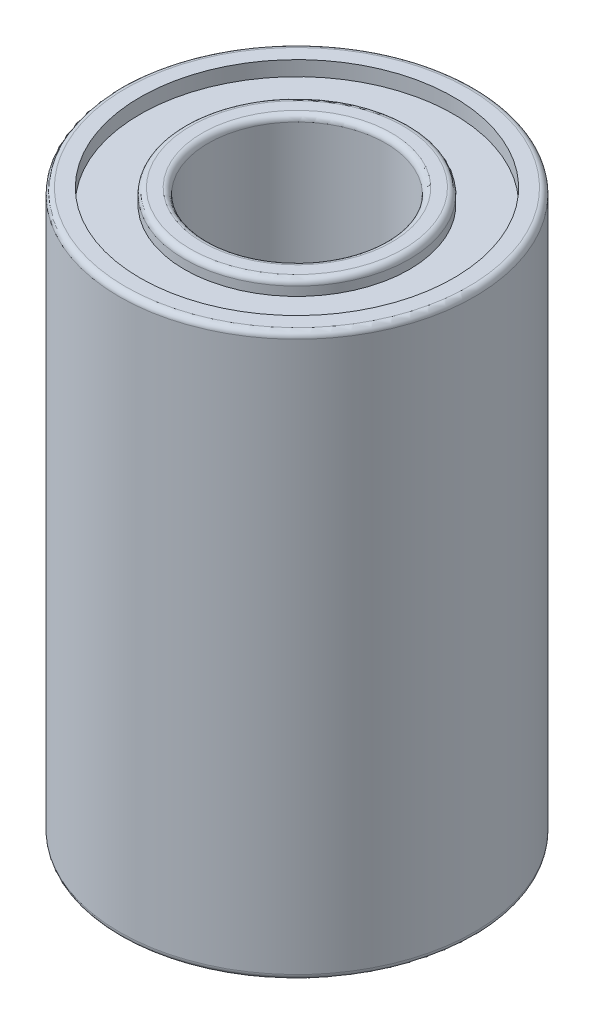
ISO-10303-21;
HEADER;
FILE_DESCRIPTION(('STEP AP214'),'2;1');
FILE_NAME('part.step','',(''),(''),'','','');
FILE_SCHEMA(('AUTOMOTIVE_DESIGN { 1 0 10303 214 1 1 1 1 }'));
ENDSEC;
DATA;
#1=APPLICATION_CONTEXT('core data for automotive mechanical design processes');
#2=APPLICATION_PROTOCOL_DEFINITION('international standard','automotive_design',2000,#1);
#3=PRODUCT_CONTEXT('',#1,'mechanical');
#4=PRODUCT('Part','Part','',(#3));
#5=PRODUCT_RELATED_PRODUCT_CATEGORY('part','',(#4));
#6=PRODUCT_DEFINITION_FORMATION('','',#4);
#7=PRODUCT_DEFINITION_CONTEXT('part definition',#1,'design');
#8=PRODUCT_DEFINITION('design','',#6,#7);
#9=PRODUCT_DEFINITION_SHAPE('','',#8);
#10=(LENGTH_UNIT() NAMED_UNIT(*) SI_UNIT(.MILLI.,.METRE.));
#11=(NAMED_UNIT(*) PLANE_ANGLE_UNIT() SI_UNIT($,.RADIAN.));
#12=(NAMED_UNIT(*) SI_UNIT($,.STERADIAN.) SOLID_ANGLE_UNIT());
#13=UNCERTAINTY_MEASURE_WITH_UNIT(LENGTH_MEASURE(1.E-05),#10,'distance_accuracy_value','');
#14=(GEOMETRIC_REPRESENTATION_CONTEXT(3) GLOBAL_UNCERTAINTY_ASSIGNED_CONTEXT((#13)) GLOBAL_UNIT_ASSIGNED_CONTEXT((#10,
#11,#12)) REPRESENTATION_CONTEXT('',''));
#15=CARTESIAN_POINT('',(0.,0.,0.));
#16=DIRECTION('',(0.,0.,1.));
#17=DIRECTION('',(1.,0.,0.));
#18=AXIS2_PLACEMENT_3D('',#15,#16,#17);
#19=CARTESIAN_POINT('',(0.,0.,0.));
#20=DIRECTION('',(0.,1.,0.));
#21=DIRECTION('',(0.,0.,1.));
#22=AXIS2_PLACEMENT_3D('',#19,#20,#21);
#23=PLANE('',#22);
#24=CARTESIAN_POINT('',(0.,0.,0.));
#25=DIRECTION('',(0.,1.,0.));
#26=DIRECTION('',(0.,0.,1.));
#27=AXIS2_PLACEMENT_3D('',#24,#25,#26);
#28=CIRCLE('',#27,3.2);
#29=CARTESIAN_POINT('',(0.,0.,3.2));
#30=VERTEX_POINT('',#29);
#31=EDGE_CURVE('E76',#30,#30,#28,.T.);
#32=ORIENTED_EDGE('',*,*,#31,.T.);
#33=EDGE_LOOP('',(#32));
#34=FACE_BOUND('',#33,.T.);
#35=CARTESIAN_POINT('',(0.,0.,0.));
#36=DIRECTION('',(0.,1.,0.));
#37=DIRECTION('',(0.,0.,1.));
#38=AXIS2_PLACEMENT_3D('',#35,#36,#37);
#39=CIRCLE('',#38,3.6);
#40=CARTESIAN_POINT('',(0.,0.,3.6));
#41=VERTEX_POINT('',#40);
#42=EDGE_CURVE('E79',#41,#41,#39,.F.);
#43=ORIENTED_EDGE('',*,*,#42,.T.);
#44=EDGE_LOOP('',(#43));
#45=FACE_BOUND('',#44,.T.);
#46=ADVANCED_FACE('F41',(#34,#45),#23,.F.);
#47=CARTESIAN_POINT('',(0.,19.,0.));
#48=DIRECTION('',(0.,1.,0.));
#49=DIRECTION('',(0.,0.,1.));
#50=AXIS2_PLACEMENT_3D('',#47,#48,#49);
#51=PLANE('',#50);
#52=CARTESIAN_POINT('',(0.,19.,0.));
#53=DIRECTION('',(0.,1.,0.));
#54=DIRECTION('',(0.,0.,1.));
#55=AXIS2_PLACEMENT_3D('',#52,#53,#54);
#56=CIRCLE('',#55,3.2);
#57=CARTESIAN_POINT('',(0.,19.,3.2));
#58=VERTEX_POINT('',#57);
#59=EDGE_CURVE('E48',#58,#58,#56,.F.);
#60=ORIENTED_EDGE('',*,*,#59,.T.);
#61=EDGE_LOOP('',(#60));
#62=FACE_BOUND('',#61,.T.);
#63=CARTESIAN_POINT('',(0.,19.,0.));
#64=DIRECTION('',(0.,1.,0.));
#65=DIRECTION('',(0.,0.,1.));
#66=AXIS2_PLACEMENT_3D('',#63,#64,#65);
#67=CIRCLE('',#66,3.6);
#68=CARTESIAN_POINT('',(0.,19.,3.6));
#69=VERTEX_POINT('',#68);
#70=EDGE_CURVE('E52',#69,#69,#67,.T.);
#71=ORIENTED_EDGE('',*,*,#70,.T.);
#72=EDGE_LOOP('',(#71));
#73=FACE_BOUND('',#72,.T.);
#74=ADVANCED_FACE('F129',(#62,#73),#51,.T.);
#75=CARTESIAN_POINT('',(0.,19.,0.));
#76=DIRECTION('',(0.,1.,0.));
#77=DIRECTION('',(0.,0.,1.));
#78=AXIS2_PLACEMENT_3D('',#75,#76,#77);
#79=CIRCLE('',#78,5.8);
#80=CARTESIAN_POINT('',(0.,19.,5.8));
#81=VERTEX_POINT('',#80);
#82=EDGE_CURVE('E88',#81,#81,#79,.T.);
#83=ORIENTED_EDGE('',*,*,#82,.T.);
#84=EDGE_LOOP('',(#83));
#85=FACE_BOUND('',#84,.T.);
#86=CARTESIAN_POINT('',(0.,19.,0.));
#87=DIRECTION('',(0.,1.,0.));
#88=DIRECTION('',(0.,0.,1.));
#89=AXIS2_PLACEMENT_3D('',#86,#87,#88);
#90=CIRCLE('',#89,5.3);
#91=CARTESIAN_POINT('',(0.,19.,5.3));
#92=VERTEX_POINT('',#91);
#93=EDGE_CURVE('E92',#92,#92,#90,.T.);
#94=ORIENTED_EDGE('',*,*,#93,.F.);
#95=EDGE_LOOP('',(#94));
#96=FACE_BOUND('',#95,.T.);
#97=ADVANCED_FACE('F137',(#85,#96),#51,.T.);
#98=CARTESIAN_POINT('',(0.,0.,0.));
#99=DIRECTION('',(0.,1.,0.));
#100=DIRECTION('',(0.,0.,1.));
#101=AXIS2_PLACEMENT_3D('',#98,#99,#100);
#102=CIRCLE('',#101,5.5);
#103=CARTESIAN_POINT('',(0.,0.,5.5));
#104=VERTEX_POINT('',#103);
#105=EDGE_CURVE('E56',#104,#104,#102,.T.);
#106=ORIENTED_EDGE('',*,*,#105,.T.);
#107=EDGE_LOOP('',(#106));
#108=FACE_BOUND('',#107,.T.);
#109=CARTESIAN_POINT('',(0.,0.,0.));
#110=DIRECTION('',(0.,1.,0.));
#111=DIRECTION('',(0.,0.,1.));
#112=AXIS2_PLACEMENT_3D('',#109,#110,#111);
#113=CIRCLE('',#112,5.8);
#114=CARTESIAN_POINT('',(0.,0.,5.8));
#115=VERTEX_POINT('',#114);
#116=EDGE_CURVE('E61',#115,#115,#113,.F.);
#117=ORIENTED_EDGE('',*,*,#116,.T.);
#118=EDGE_LOOP('',(#117));
#119=FACE_BOUND('',#118,.T.);
#120=ADVANCED_FACE('F132',(#108,#119),#23,.F.);
#121=CARTESIAN_POINT('',(0.,19.,0.));
#122=DIRECTION('',(0.,-1.,0.));
#123=DIRECTION('',(0.,0.,-1.));
#124=AXIS2_PLACEMENT_3D('',#121,#122,#123);
#125=CYLINDRICAL_SURFACE('',#124,6.);
#126=CARTESIAN_POINT('',(0.,18.8,0.));
#127=DIRECTION('',(0.,1.,0.));
#128=DIRECTION('',(0.,0.,1.));
#129=AXIS2_PLACEMENT_3D('',#126,#127,#128);
#130=CIRCLE('',#129,6.);
#131=CARTESIAN_POINT('',(0.,18.8,6.));
#132=VERTEX_POINT('',#131);
#133=EDGE_CURVE('E82',#132,#132,#130,.F.);
#134=ORIENTED_EDGE('',*,*,#133,.T.);
#135=EDGE_LOOP('',(#134));
#136=FACE_BOUND('',#135,.T.);
#137=CARTESIAN_POINT('',(0.,0.199999999999999,0.));
#138=DIRECTION('',(0.,1.,0.));
#139=DIRECTION('',(0.,0.,1.));
#140=AXIS2_PLACEMENT_3D('',#137,#138,#139);
#141=CIRCLE('',#140,6.);
#142=CARTESIAN_POINT('',(0.,0.199999999999999,6.));
#143=VERTEX_POINT('',#142);
#144=EDGE_CURVE('E85',#143,#143,#141,.T.);
#145=ORIENTED_EDGE('',*,*,#144,.T.);
#146=EDGE_LOOP('',(#145));
#147=FACE_BOUND('',#146,.T.);
#148=ADVANCED_FACE('F142',(#136,#147),#125,.T.);
#149=CARTESIAN_POINT('',(0.,19.,0.));
#150=DIRECTION('',(0.,-1.,0.));
#151=DIRECTION('',(0.,0.,-1.));
#152=AXIS2_PLACEMENT_3D('',#149,#150,#151);
#153=CYLINDRICAL_SURFACE('',#152,3.);
#154=CARTESIAN_POINT('',(0.,0.199999999999999,0.));
#155=DIRECTION('',(0.,1.,0.));
#156=DIRECTION('',(0.,0.,1.));
#157=AXIS2_PLACEMENT_3D('',#154,#155,#156);
#158=CIRCLE('',#157,3.);
#159=CARTESIAN_POINT('',(0.,0.199999999999999,3.));
#160=VERTEX_POINT('',#159);
#161=EDGE_CURVE('E70',#160,#160,#158,.F.);
#162=ORIENTED_EDGE('',*,*,#161,.T.);
#163=EDGE_LOOP('',(#162));
#164=FACE_BOUND('',#163,.T.);
#165=CARTESIAN_POINT('',(0.,18.8,0.));
#166=DIRECTION('',(0.,1.,0.));
#167=DIRECTION('',(0.,0.,1.));
#168=AXIS2_PLACEMENT_3D('',#165,#166,#167);
#169=CIRCLE('',#168,3.);
#170=CARTESIAN_POINT('',(0.,18.8,3.));
#171=VERTEX_POINT('',#170);
#172=EDGE_CURVE('E73',#171,#171,#169,.T.);
#173=ORIENTED_EDGE('',*,*,#172,.T.);
#174=EDGE_LOOP('',(#173));
#175=FACE_BOUND('',#174,.T.);
#176=ADVANCED_FACE('F148',(#164,#175),#153,.F.);
#177=CARTESIAN_POINT('',(0.,18.5,0.));
#178=DIRECTION('',(0.,1.,0.));
#179=DIRECTION('',(0.,0.,1.));
#180=AXIS2_PLACEMENT_3D('',#177,#178,#179);
#181=CYLINDRICAL_SURFACE('',#180,3.8);
#182=CARTESIAN_POINT('',(0.,18.8,0.));
#183=DIRECTION('',(0.,1.,0.));
#184=DIRECTION('',(0.,0.,1.));
#185=AXIS2_PLACEMENT_3D('',#182,#183,#184);
#186=CIRCLE('',#185,3.8);
#187=CARTESIAN_POINT('',(0.,18.8,3.8));
#188=VERTEX_POINT('',#187);
#189=EDGE_CURVE('E10',#188,#188,#186,.F.);
#190=ORIENTED_EDGE('',*,*,#189,.T.);
#191=EDGE_LOOP('',(#190));
#192=FACE_BOUND('',#191,.T.);
#193=CARTESIAN_POINT('',(0.,18.5,0.));
#194=DIRECTION('',(0.,1.,0.));
#195=DIRECTION('',(0.,0.,1.));
#196=AXIS2_PLACEMENT_3D('',#193,#194,#195);
#197=CIRCLE('',#196,3.8);
#198=CARTESIAN_POINT('',(0.,18.5,3.8));
#199=VERTEX_POINT('',#198);
#200=EDGE_CURVE('E95',#199,#199,#197,.T.);
#201=ORIENTED_EDGE('',*,*,#200,.T.);
#202=EDGE_LOOP('',(#201));
#203=FACE_BOUND('',#202,.T.);
#204=ADVANCED_FACE('F193',(#192,#203),#181,.T.);
#205=CARTESIAN_POINT('',(0.,18.5,0.));
#206=DIRECTION('',(0.,1.,0.));
#207=DIRECTION('',(0.,0.,1.));
#208=AXIS2_PLACEMENT_3D('',#205,#206,#207);
#209=CYLINDRICAL_SURFACE('',#208,5.3);
#210=CARTESIAN_POINT('',(0.,18.5,0.));
#211=DIRECTION('',(0.,1.,0.));
#212=DIRECTION('',(0.,0.,1.));
#213=AXIS2_PLACEMENT_3D('',#210,#211,#212);
#214=CIRCLE('',#213,5.3);
#215=CARTESIAN_POINT('',(0.,18.5,5.3));
#216=VERTEX_POINT('',#215);
#217=EDGE_CURVE('E91',#216,#216,#214,.T.);
#218=ORIENTED_EDGE('',*,*,#217,.F.);
#219=EDGE_LOOP('',(#218));
#220=FACE_BOUND('',#219,.T.);
#221=ORIENTED_EDGE('',*,*,#93,.T.);
#222=EDGE_LOOP('',(#221));
#223=FACE_BOUND('',#222,.T.);
#224=ADVANCED_FACE('F125',(#220,#223),#209,.F.);
#225=CARTESIAN_POINT('',(0.,18.5,0.));
#226=DIRECTION('',(0.,1.,0.));
#227=DIRECTION('',(0.,0.,1.));
#228=AXIS2_PLACEMENT_3D('',#225,#226,#227);
#229=PLANE('',#228);
#230=ORIENTED_EDGE('',*,*,#200,.F.);
#231=EDGE_LOOP('',(#230));
#232=FACE_BOUND('',#231,.T.);
#233=ORIENTED_EDGE('',*,*,#217,.T.);
#234=EDGE_LOOP('',(#233));
#235=FACE_BOUND('',#234,.T.);
#236=ADVANCED_FACE('F117',(#232,#235),#229,.T.);
#237=CARTESIAN_POINT('',(0.,0.5,0.));
#238=DIRECTION('',(0.,-1.,0.));
#239=DIRECTION('',(0.,0.,-1.));
#240=AXIS2_PLACEMENT_3D('',#237,#238,#239);
#241=CYLINDRICAL_SURFACE('',#240,5.3);
#242=CARTESIAN_POINT('',(0.,0.2,0.));
#243=DIRECTION('',(0.,1.,0.));
#244=DIRECTION('',(0.,0.,1.));
#245=AXIS2_PLACEMENT_3D('',#242,#243,#244);
#246=CIRCLE('',#245,5.3);
#247=CARTESIAN_POINT('',(0.,0.2,5.3));
#248=VERTEX_POINT('',#247);
#249=EDGE_CURVE('E64',#248,#248,#246,.F.);
#250=ORIENTED_EDGE('',*,*,#249,.T.);
#251=EDGE_LOOP('',(#250));
#252=FACE_BOUND('',#251,.T.);
#253=CARTESIAN_POINT('',(0.,0.5,0.));
#254=DIRECTION('',(0.,-1.,0.));
#255=DIRECTION('',(0.,0.,-1.));
#256=AXIS2_PLACEMENT_3D('',#253,#254,#255);
#257=CIRCLE('',#256,5.3);
#258=CARTESIAN_POINT('',(0.,0.5,-5.3));
#259=VERTEX_POINT('',#258);
#260=EDGE_CURVE('E96',#259,#259,#257,.T.);
#261=ORIENTED_EDGE('',*,*,#260,.F.);
#262=EDGE_LOOP('',(#261));
#263=FACE_BOUND('',#262,.T.);
#264=ADVANCED_FACE('F112',(#252,#263),#241,.F.);
#265=CARTESIAN_POINT('',(0.,0.5,0.));
#266=DIRECTION('',(0.,-1.,0.));
#267=DIRECTION('',(0.,0.,-1.));
#268=AXIS2_PLACEMENT_3D('',#265,#266,#267);
#269=PLANE('',#268);
#270=CARTESIAN_POINT('',(0.,0.5,0.));
#271=DIRECTION('',(0.,-1.,0.));
#272=DIRECTION('',(0.,0.,-1.));
#273=AXIS2_PLACEMENT_3D('',#270,#271,#272);
#274=CIRCLE('',#273,3.8);
#275=CARTESIAN_POINT('',(0.,0.5,-3.8));
#276=VERTEX_POINT('',#275);
#277=EDGE_CURVE('E103',#276,#276,#274,.T.);
#278=ORIENTED_EDGE('',*,*,#277,.F.);
#279=EDGE_LOOP('',(#278));
#280=FACE_BOUND('',#279,.T.);
#281=ORIENTED_EDGE('',*,*,#260,.T.);
#282=EDGE_LOOP('',(#281));
#283=FACE_BOUND('',#282,.T.);
#284=ADVANCED_FACE('F109',(#280,#283),#269,.T.);
#285=CARTESIAN_POINT('',(0.,0.5,0.));
#286=DIRECTION('',(0.,-1.,0.));
#287=DIRECTION('',(0.,0.,-1.));
#288=AXIS2_PLACEMENT_3D('',#285,#286,#287);
#289=CYLINDRICAL_SURFACE('',#288,3.8);
#290=CARTESIAN_POINT('',(0.,0.2,0.));
#291=DIRECTION('',(0.,1.,0.));
#292=DIRECTION('',(0.,0.,1.));
#293=AXIS2_PLACEMENT_3D('',#290,#291,#292);
#294=CIRCLE('',#293,3.8);
#295=CARTESIAN_POINT('',(0.,0.2,3.8));
#296=VERTEX_POINT('',#295);
#297=EDGE_CURVE('E67',#296,#296,#294,.T.);
#298=ORIENTED_EDGE('',*,*,#297,.T.);
#299=EDGE_LOOP('',(#298));
#300=FACE_BOUND('',#299,.T.);
#301=ORIENTED_EDGE('',*,*,#277,.T.);
#302=EDGE_LOOP('',(#301));
#303=FACE_BOUND('',#302,.T.);
#304=ADVANCED_FACE('F107',(#300,#303),#289,.T.);
#305=CARTESIAN_POINT('',(0.,18.8,0.));
#306=DIRECTION('',(0.,1.,0.));
#307=DIRECTION('',(0.,0.,1.));
#308=AXIS2_PLACEMENT_3D('',#305,#306,#307);
#309=TOROIDAL_SURFACE('',#308,5.8,0.2);
#310=ORIENTED_EDGE('',*,*,#133,.F.);
#311=EDGE_LOOP('',(#310));
#312=FACE_BOUND('',#311,.T.);
#313=ORIENTED_EDGE('',*,*,#82,.F.);
#314=EDGE_LOOP('',(#313));
#315=FACE_BOUND('',#314,.T.);
#316=ADVANCED_FACE('F178',(#312,#315),#309,.T.);
#317=CARTESIAN_POINT('',(0.,0.199999999999999,0.));
#318=DIRECTION('',(0.,1.,0.));
#319=DIRECTION('',(0.,0.,1.));
#320=AXIS2_PLACEMENT_3D('',#317,#318,#319);
#321=TOROIDAL_SURFACE('',#320,3.2,0.2);
#322=ORIENTED_EDGE('',*,*,#161,.F.);
#323=EDGE_LOOP('',(#322));
#324=FACE_BOUND('',#323,.T.);
#325=ORIENTED_EDGE('',*,*,#31,.F.);
#326=EDGE_LOOP('',(#325));
#327=FACE_BOUND('',#326,.T.);
#328=ADVANCED_FACE('F174',(#324,#327),#321,.T.);
#329=CARTESIAN_POINT('',(0.,0.2,0.));
#330=DIRECTION('',(0.,1.,0.));
#331=DIRECTION('',(0.,0.,1.));
#332=AXIS2_PLACEMENT_3D('',#329,#330,#331);
#333=TOROIDAL_SURFACE('',#332,3.6,0.2);
#334=ORIENTED_EDGE('',*,*,#297,.F.);
#335=EDGE_LOOP('',(#334));
#336=FACE_BOUND('',#335,.T.);
#337=ORIENTED_EDGE('',*,*,#42,.F.);
#338=EDGE_LOOP('',(#337));
#339=FACE_BOUND('',#338,.T.);
#340=ADVANCED_FACE('F168',(#336,#339),#333,.T.);
#341=CARTESIAN_POINT('',(0.,0.2,0.));
#342=DIRECTION('',(0.,1.,0.));
#343=DIRECTION('',(0.,0.,1.));
#344=AXIS2_PLACEMENT_3D('',#341,#342,#343);
#345=TOROIDAL_SURFACE('',#344,5.5,0.2);
#346=ORIENTED_EDGE('',*,*,#105,.F.);
#347=EDGE_LOOP('',(#346));
#348=FACE_BOUND('',#347,.T.);
#349=ORIENTED_EDGE('',*,*,#249,.F.);
#350=EDGE_LOOP('',(#349));
#351=FACE_BOUND('',#350,.T.);
#352=ADVANCED_FACE('F159',(#348,#351),#345,.T.);
#353=CARTESIAN_POINT('',(0.,0.199999999999999,0.));
#354=DIRECTION('',(0.,1.,0.));
#355=DIRECTION('',(0.,0.,1.));
#356=AXIS2_PLACEMENT_3D('',#353,#354,#355);
#357=TOROIDAL_SURFACE('',#356,5.8,0.2);
#358=ORIENTED_EDGE('',*,*,#116,.F.);
#359=EDGE_LOOP('',(#358));
#360=FACE_BOUND('',#359,.T.);
#361=ORIENTED_EDGE('',*,*,#144,.F.);
#362=EDGE_LOOP('',(#361));
#363=FACE_BOUND('',#362,.T.);
#364=ADVANCED_FACE('F155',(#360,#363),#357,.T.);
#365=CARTESIAN_POINT('',(0.,18.8,0.));
#366=DIRECTION('',(0.,1.,0.));
#367=DIRECTION('',(0.,0.,1.));
#368=AXIS2_PLACEMENT_3D('',#365,#366,#367);
#369=TOROIDAL_SURFACE('',#368,3.2,0.2);
#370=ORIENTED_EDGE('',*,*,#59,.F.);
#371=EDGE_LOOP('',(#370));
#372=FACE_BOUND('',#371,.T.);
#373=ORIENTED_EDGE('',*,*,#172,.F.);
#374=EDGE_LOOP('',(#373));
#375=FACE_BOUND('',#374,.T.);
#376=ADVANCED_FACE('F158',(#372,#375),#369,.T.);
#377=CARTESIAN_POINT('',(0.,18.8,0.));
#378=DIRECTION('',(0.,1.,0.));
#379=DIRECTION('',(0.,0.,1.));
#380=AXIS2_PLACEMENT_3D('',#377,#378,#379);
#381=TOROIDAL_SURFACE('',#380,3.6,0.2);
#382=ORIENTED_EDGE('',*,*,#189,.F.);
#383=EDGE_LOOP('',(#382));
#384=FACE_BOUND('',#383,.T.);
#385=ORIENTED_EDGE('',*,*,#70,.F.);
#386=EDGE_LOOP('',(#385));
#387=FACE_BOUND('',#386,.T.);
#388=ADVANCED_FACE('F43',(#384,#387),#381,.T.);
#389=CLOSED_SHELL('',(#46,#74,#97,#120,#148,#176,#204,#224,#236,#264,#284,#304,#316,#328,#340,
#352,#364,#376,#388));
#390=MANIFOLD_SOLID_BREP('B2',#389);
#391=ADVANCED_BREP_SHAPE_REPRESENTATION('',(#18,#390),#14);
#392=SHAPE_DEFINITION_REPRESENTATION(#9,#391);
ENDSEC;
END-ISO-10303-21;
